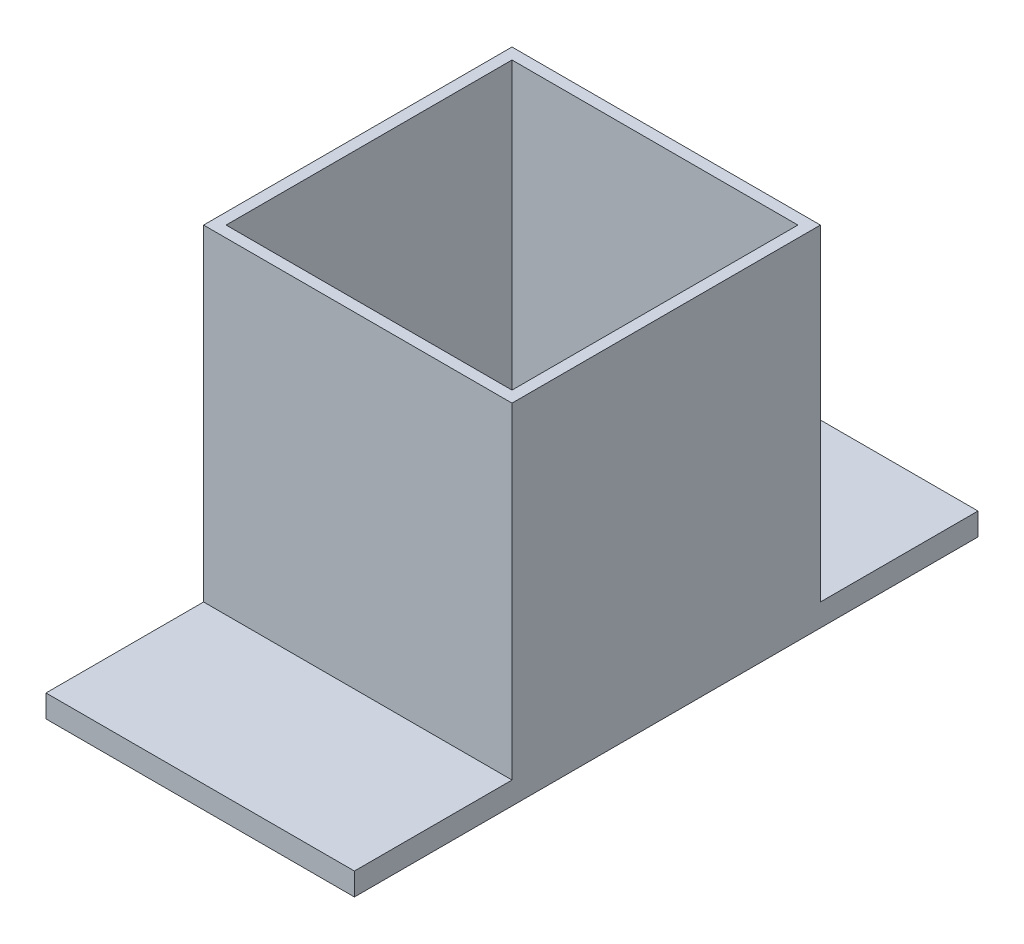
ISO-10303-21;
HEADER;
FILE_DESCRIPTION(('STEP AP214'),'2;1');
FILE_NAME('part.step','',(''),(''),'','','');
FILE_SCHEMA(('AUTOMOTIVE_DESIGN { 1 0 10303 214 1 1 1 1 }'));
ENDSEC;
DATA;
#1=APPLICATION_CONTEXT('core data for automotive mechanical design processes');
#2=APPLICATION_PROTOCOL_DEFINITION('international standard','automotive_design',2000,#1);
#3=PRODUCT_CONTEXT('',#1,'mechanical');
#4=PRODUCT('Part','Part','',(#3));
#5=PRODUCT_RELATED_PRODUCT_CATEGORY('part','',(#4));
#6=PRODUCT_DEFINITION_FORMATION('','',#4);
#7=PRODUCT_DEFINITION_CONTEXT('part definition',#1,'design');
#8=PRODUCT_DEFINITION('design','',#6,#7);
#9=PRODUCT_DEFINITION_SHAPE('','',#8);
#10=(LENGTH_UNIT() NAMED_UNIT(*) SI_UNIT(.MILLI.,.METRE.));
#11=(NAMED_UNIT(*) PLANE_ANGLE_UNIT() SI_UNIT($,.RADIAN.));
#12=(NAMED_UNIT(*) SI_UNIT($,.STERADIAN.) SOLID_ANGLE_UNIT());
#13=UNCERTAINTY_MEASURE_WITH_UNIT(LENGTH_MEASURE(1.E-05),#10,'distance_accuracy_value','');
#14=(GEOMETRIC_REPRESENTATION_CONTEXT(3) GLOBAL_UNCERTAINTY_ASSIGNED_CONTEXT((#13)) GLOBAL_UNIT_ASSIGNED_CONTEXT((#10,
#11,#12)) REPRESENTATION_CONTEXT('',''));
#15=CARTESIAN_POINT('',(0.,0.,0.));
#16=DIRECTION('',(0.,0.,1.));
#17=DIRECTION('',(1.,0.,0.));
#18=AXIS2_PLACEMENT_3D('',#15,#16,#17);
#19=CARTESIAN_POINT('',(0.,-0.5,-13.7));
#20=DIRECTION('',(0.,0.,1.));
#21=DIRECTION('',(1.,0.,0.));
#22=AXIS2_PLACEMENT_3D('',#19,#20,#21);
#23=PLANE('',#22);
#24=DIRECTION('',(1.,0.,0.));
#25=VECTOR('',#24,1.);
#26=CARTESIAN_POINT('',(13.7,0.5,-13.7));
#27=LINE('',#26,#25);
#28=CARTESIAN_POINT('',(0.,0.5,-13.7));
#29=VERTEX_POINT('',#28);
#30=CARTESIAN_POINT('',(13.7,0.5,-13.7));
#31=VERTEX_POINT('',#30);
#32=EDGE_CURVE('E56',#29,#31,#27,.T.);
#33=ORIENTED_EDGE('',*,*,#32,.F.);
#34=DIRECTION('',(0.,1.,0.));
#35=VECTOR('',#34,1.);
#36=CARTESIAN_POINT('',(0.,-0.5,-13.7));
#37=LINE('',#36,#35);
#38=CARTESIAN_POINT('',(0.,15.,-13.7));
#39=VERTEX_POINT('',#38);
#40=EDGE_CURVE('E42',#29,#39,#37,.T.);
#41=ORIENTED_EDGE('',*,*,#40,.T.);
#42=DIRECTION('',(1.,0.,0.));
#43=VECTOR('',#42,1.);
#44=CARTESIAN_POINT('',(0.,15.,-13.7));
#45=LINE('',#44,#43);
#46=CARTESIAN_POINT('',(13.7,15.,-13.7));
#47=VERTEX_POINT('',#46);
#48=EDGE_CURVE('E220',#39,#47,#45,.T.);
#49=ORIENTED_EDGE('',*,*,#48,.T.);
#50=DIRECTION('',(0.,1.,0.));
#51=VECTOR('',#50,1.);
#52=CARTESIAN_POINT('',(13.7,-0.5,-13.7));
#53=LINE('',#52,#51);
#54=EDGE_CURVE('E11',#31,#47,#53,.T.);
#55=ORIENTED_EDGE('',*,*,#54,.F.);
#56=EDGE_LOOP('',(#33,#41,#49,#55));
#57=FACE_BOUND('',#56,.T.);
#58=ADVANCED_FACE('F39',(#57),#23,.F.);
#59=CARTESIAN_POINT('',(13.7,-0.5,0.));
#60=DIRECTION('',(1.,0.,0.));
#61=DIRECTION('',(0.,0.,-1.));
#62=AXIS2_PLACEMENT_3D('',#59,#60,#61);
#63=PLANE('',#62);
#64=DIRECTION('',(0.,0.,-1.));
#65=VECTOR('',#64,1.);
#66=CARTESIAN_POINT('',(13.7,-0.5,0.));
#67=LINE('',#66,#65);
#68=CARTESIAN_POINT('',(13.7,-0.5,7.));
#69=VERTEX_POINT('',#68);
#70=CARTESIAN_POINT('',(13.7,-0.5,-20.7));
#71=VERTEX_POINT('',#70);
#72=EDGE_CURVE('E129',#69,#71,#67,.T.);
#73=ORIENTED_EDGE('',*,*,#72,.T.);
#74=DIRECTION('',(0.,-1.,0.));
#75=VECTOR('',#74,1.);
#76=CARTESIAN_POINT('',(13.7,-0.5,-20.7));
#77=LINE('',#76,#75);
#78=CARTESIAN_POINT('',(13.7,0.5,-20.7));
#79=VERTEX_POINT('',#78);
#80=EDGE_CURVE('E134',#79,#71,#77,.T.);
#81=ORIENTED_EDGE('',*,*,#80,.F.);
#82=DIRECTION('',(0.,0.,1.));
#83=VECTOR('',#82,1.);
#84=CARTESIAN_POINT('',(13.7,0.5,-20.7));
#85=LINE('',#84,#83);
#86=EDGE_CURVE('E163',#79,#31,#85,.T.);
#87=ORIENTED_EDGE('',*,*,#86,.T.);
#88=ORIENTED_EDGE('',*,*,#54,.T.);
#89=DIRECTION('',(0.,0.,-1.));
#90=VECTOR('',#89,1.);
#91=CARTESIAN_POINT('',(13.7,15.,0.));
#92=LINE('',#91,#90);
#93=CARTESIAN_POINT('',(13.7,15.,0.));
#94=VERTEX_POINT('',#93);
#95=EDGE_CURVE('E216',#94,#47,#92,.T.);
#96=ORIENTED_EDGE('',*,*,#95,.F.);
#97=DIRECTION('',(0.,1.,0.));
#98=VECTOR('',#97,1.);
#99=CARTESIAN_POINT('',(13.7,-0.5,0.));
#100=LINE('',#99,#98);
#101=CARTESIAN_POINT('',(13.7,0.5,0.));
#102=VERTEX_POINT('',#101);
#103=EDGE_CURVE('E48',#102,#94,#100,.T.);
#104=ORIENTED_EDGE('',*,*,#103,.F.);
#105=DIRECTION('',(0.,0.,-1.));
#106=VECTOR('',#105,1.);
#107=CARTESIAN_POINT('',(13.7,0.5,7.));
#108=LINE('',#107,#106);
#109=CARTESIAN_POINT('',(13.7,0.5,7.));
#110=VERTEX_POINT('',#109);
#111=EDGE_CURVE('E189',#110,#102,#108,.T.);
#112=ORIENTED_EDGE('',*,*,#111,.F.);
#113=DIRECTION('',(0.,1.,0.));
#114=VECTOR('',#113,1.);
#115=CARTESIAN_POINT('',(13.7,-0.5,7.));
#116=LINE('',#115,#114);
#117=EDGE_CURVE('E136',#69,#110,#116,.T.);
#118=ORIENTED_EDGE('',*,*,#117,.F.);
#119=EDGE_LOOP('',(#73,#81,#87,#88,#96,#104,#112,#118));
#120=FACE_BOUND('',#119,.T.);
#121=ADVANCED_FACE('F131',(#120),#63,.T.);
#122=CARTESIAN_POINT('',(0.,-0.5,0.));
#123=DIRECTION('',(0.,0.,1.));
#124=DIRECTION('',(1.,0.,0.));
#125=AXIS2_PLACEMENT_3D('',#122,#123,#124);
#126=PLANE('',#125);
#127=DIRECTION('',(-1.,0.,0.));
#128=VECTOR('',#127,1.);
#129=CARTESIAN_POINT('',(0.,0.5,0.));
#130=LINE('',#129,#128);
#131=CARTESIAN_POINT('',(0.,0.5,0.));
#132=VERTEX_POINT('',#131);
#133=EDGE_CURVE('E64',#102,#132,#130,.T.);
#134=ORIENTED_EDGE('',*,*,#133,.F.);
#135=ORIENTED_EDGE('',*,*,#103,.T.);
#136=DIRECTION('',(1.,0.,0.));
#137=VECTOR('',#136,1.);
#138=CARTESIAN_POINT('',(0.,15.,0.));
#139=LINE('',#138,#137);
#140=CARTESIAN_POINT('',(0.,15.,0.));
#141=VERTEX_POINT('',#140);
#142=EDGE_CURVE('E212',#141,#94,#139,.T.);
#143=ORIENTED_EDGE('',*,*,#142,.F.);
#144=DIRECTION('',(0.,1.,0.));
#145=VECTOR('',#144,1.);
#146=CARTESIAN_POINT('',(0.,-0.5,0.));
#147=LINE('',#146,#145);
#148=EDGE_CURVE('E253',#132,#141,#147,.T.);
#149=ORIENTED_EDGE('',*,*,#148,.F.);
#150=EDGE_LOOP('',(#134,#135,#143,#149));
#151=FACE_BOUND('',#150,.T.);
#152=ADVANCED_FACE('F292',(#151),#126,.T.);
#153=CARTESIAN_POINT('',(0.,-0.5,0.));
#154=DIRECTION('',(1.,0.,0.));
#155=DIRECTION('',(0.,0.,-1.));
#156=AXIS2_PLACEMENT_3D('',#153,#154,#155);
#157=PLANE('',#156);
#158=DIRECTION('',(0.,0.,-1.));
#159=VECTOR('',#158,1.);
#160=CARTESIAN_POINT('',(0.,-0.5,0.));
#161=LINE('',#160,#159);
#162=CARTESIAN_POINT('',(0.,-0.5,7.));
#163=VERTEX_POINT('',#162);
#164=CARTESIAN_POINT('',(0.,-0.5,-20.7));
#165=VERTEX_POINT('',#164);
#166=EDGE_CURVE('E141',#163,#165,#161,.T.);
#167=ORIENTED_EDGE('',*,*,#166,.F.);
#168=DIRECTION('',(0.,-1.,0.));
#169=VECTOR('',#168,1.);
#170=CARTESIAN_POINT('',(0.,-0.5,7.));
#171=LINE('',#170,#169);
#172=CARTESIAN_POINT('',(0.,0.5,7.));
#173=VERTEX_POINT('',#172);
#174=EDGE_CURVE('E171',#173,#163,#171,.T.);
#175=ORIENTED_EDGE('',*,*,#174,.F.);
#176=DIRECTION('',(0.,0.,-1.));
#177=VECTOR('',#176,1.);
#178=CARTESIAN_POINT('',(0.,0.5,7.));
#179=LINE('',#178,#177);
#180=EDGE_CURVE('E183',#173,#132,#179,.T.);
#181=ORIENTED_EDGE('',*,*,#180,.T.);
#182=ORIENTED_EDGE('',*,*,#148,.T.);
#183=DIRECTION('',(0.,0.,-1.));
#184=VECTOR('',#183,1.);
#185=CARTESIAN_POINT('',(0.,15.,0.));
#186=LINE('',#185,#184);
#187=EDGE_CURVE('E208',#141,#39,#186,.T.);
#188=ORIENTED_EDGE('',*,*,#187,.T.);
#189=ORIENTED_EDGE('',*,*,#40,.F.);
#190=DIRECTION('',(0.,0.,1.));
#191=VECTOR('',#190,1.);
#192=CARTESIAN_POINT('',(0.,0.5,-20.7));
#193=LINE('',#192,#191);
#194=CARTESIAN_POINT('',(0.,0.5,-20.7));
#195=VERTEX_POINT('',#194);
#196=EDGE_CURVE('E167',#195,#29,#193,.T.);
#197=ORIENTED_EDGE('',*,*,#196,.F.);
#198=DIRECTION('',(0.,1.,0.));
#199=VECTOR('',#198,1.);
#200=CARTESIAN_POINT('',(0.,-0.5,-20.7));
#201=LINE('',#200,#199);
#202=EDGE_CURVE('E149',#165,#195,#201,.T.);
#203=ORIENTED_EDGE('',*,*,#202,.F.);
#204=EDGE_LOOP('',(#167,#175,#181,#182,#188,#189,#197,#203));
#205=FACE_BOUND('',#204,.T.);
#206=ADVANCED_FACE('F261',(#205),#157,.F.);
#207=CARTESIAN_POINT('',(0.,-0.5,0.));
#208=DIRECTION('',(0.,1.,0.));
#209=DIRECTION('',(0.,0.,1.));
#210=AXIS2_PLACEMENT_3D('',#207,#208,#209);
#211=PLANE('',#210);
#212=ORIENTED_EDGE('',*,*,#166,.T.);
#213=DIRECTION('',(-1.,0.,0.));
#214=VECTOR('',#213,1.);
#215=CARTESIAN_POINT('',(13.7,-0.5,-20.7));
#216=LINE('',#215,#214);
#217=EDGE_CURVE('E144',#71,#165,#216,.T.);
#218=ORIENTED_EDGE('',*,*,#217,.F.);
#219=ORIENTED_EDGE('',*,*,#72,.F.);
#220=DIRECTION('',(1.,0.,0.));
#221=VECTOR('',#220,1.);
#222=CARTESIAN_POINT('',(0.,-0.5,7.));
#223=LINE('',#222,#221);
#224=EDGE_CURVE('E175',#163,#69,#223,.T.);
#225=ORIENTED_EDGE('',*,*,#224,.F.);
#226=EDGE_LOOP('',(#212,#218,#219,#225));
#227=FACE_BOUND('',#226,.T.);
#228=ADVANCED_FACE('F145',(#227),#211,.F.);
#229=CARTESIAN_POINT('',(13.2,15.,0.));
#230=DIRECTION('',(-1.,0.,0.));
#231=DIRECTION('',(0.,0.,1.));
#232=AXIS2_PLACEMENT_3D('',#229,#230,#231);
#233=PLANE('',#232);
#234=DIRECTION('',(0.,0.,-1.));
#235=VECTOR('',#234,1.);
#236=CARTESIAN_POINT('',(13.2,0.,0.));
#237=LINE('',#236,#235);
#238=CARTESIAN_POINT('',(13.2,0.,-0.500000000000002));
#239=VERTEX_POINT('',#238);
#240=CARTESIAN_POINT('',(13.2,0.,-13.2));
#241=VERTEX_POINT('',#240);
#242=EDGE_CURVE('E193',#239,#241,#237,.T.);
#243=ORIENTED_EDGE('',*,*,#242,.F.);
#244=DIRECTION('',(0.,-1.,0.));
#245=VECTOR('',#244,1.);
#246=CARTESIAN_POINT('',(13.2,15.,-0.500000000000002));
#247=LINE('',#246,#245);
#248=CARTESIAN_POINT('',(13.2,15.,-0.500000000000002));
#249=VERTEX_POINT('',#248);
#250=EDGE_CURVE('E247',#249,#239,#247,.T.);
#251=ORIENTED_EDGE('',*,*,#250,.F.);
#252=DIRECTION('',(0.,0.,-1.));
#253=VECTOR('',#252,1.);
#254=CARTESIAN_POINT('',(13.2,15.,0.));
#255=LINE('',#254,#253);
#256=CARTESIAN_POINT('',(13.2,15.,-13.2));
#257=VERTEX_POINT('',#256);
#258=EDGE_CURVE('E194',#249,#257,#255,.T.);
#259=ORIENTED_EDGE('',*,*,#258,.T.);
#260=DIRECTION('',(0.,-1.,0.));
#261=VECTOR('',#260,1.);
#262=CARTESIAN_POINT('',(13.2,15.,-13.2));
#263=LINE('',#262,#261);
#264=EDGE_CURVE('E224',#257,#241,#263,.T.);
#265=ORIENTED_EDGE('',*,*,#264,.T.);
#266=EDGE_LOOP('',(#243,#251,#259,#265));
#267=FACE_BOUND('',#266,.T.);
#268=ADVANCED_FACE('F302',(#267),#233,.T.);
#269=CARTESIAN_POINT('',(0.,15.,-0.5));
#270=DIRECTION('',(0.,0.,1.));
#271=DIRECTION('',(1.,0.,0.));
#272=AXIS2_PLACEMENT_3D('',#269,#270,#271);
#273=PLANE('',#272);
#274=DIRECTION('',(-1.,0.,0.));
#275=VECTOR('',#274,1.);
#276=CARTESIAN_POINT('',(0.,0.,-0.5));
#277=LINE('',#276,#275);
#278=CARTESIAN_POINT('',(0.5,0.,-0.5));
#279=VERTEX_POINT('',#278);
#280=EDGE_CURVE('E228',#239,#279,#277,.T.);
#281=ORIENTED_EDGE('',*,*,#280,.T.);
#282=DIRECTION('',(0.,-1.,0.));
#283=VECTOR('',#282,1.);
#284=CARTESIAN_POINT('',(0.5,15.,-0.5));
#285=LINE('',#284,#283);
#286=CARTESIAN_POINT('',(0.5,15.,-0.5));
#287=VERTEX_POINT('',#286);
#288=EDGE_CURVE('E243',#287,#279,#285,.T.);
#289=ORIENTED_EDGE('',*,*,#288,.F.);
#290=DIRECTION('',(-1.,0.,0.));
#291=VECTOR('',#290,1.);
#292=CARTESIAN_POINT('',(0.,15.,-0.5));
#293=LINE('',#292,#291);
#294=EDGE_CURVE('E198',#249,#287,#293,.T.);
#295=ORIENTED_EDGE('',*,*,#294,.F.);
#296=ORIENTED_EDGE('',*,*,#250,.T.);
#297=EDGE_LOOP('',(#281,#289,#295,#296));
#298=FACE_BOUND('',#297,.T.);
#299=ADVANCED_FACE('F306',(#298),#273,.F.);
#300=CARTESIAN_POINT('',(0.5,15.,0.));
#301=DIRECTION('',(-1.,0.,0.));
#302=DIRECTION('',(0.,0.,1.));
#303=AXIS2_PLACEMENT_3D('',#300,#301,#302);
#304=PLANE('',#303);
#305=DIRECTION('',(0.,0.,-1.));
#306=VECTOR('',#305,1.);
#307=CARTESIAN_POINT('',(0.5,0.,0.));
#308=LINE('',#307,#306);
#309=CARTESIAN_POINT('',(0.5,0.,-13.2));
#310=VERTEX_POINT('',#309);
#311=EDGE_CURVE('E231',#279,#310,#308,.T.);
#312=ORIENTED_EDGE('',*,*,#311,.T.);
#313=DIRECTION('',(0.,-1.,0.));
#314=VECTOR('',#313,1.);
#315=CARTESIAN_POINT('',(0.5,15.,-13.2));
#316=LINE('',#315,#314);
#317=CARTESIAN_POINT('',(0.5,15.,-13.2));
#318=VERTEX_POINT('',#317);
#319=EDGE_CURVE('E240',#318,#310,#316,.T.);
#320=ORIENTED_EDGE('',*,*,#319,.F.);
#321=DIRECTION('',(0.,0.,-1.));
#322=VECTOR('',#321,1.);
#323=CARTESIAN_POINT('',(0.5,15.,0.));
#324=LINE('',#323,#322);
#325=EDGE_CURVE('E202',#287,#318,#324,.T.);
#326=ORIENTED_EDGE('',*,*,#325,.F.);
#327=ORIENTED_EDGE('',*,*,#288,.T.);
#328=EDGE_LOOP('',(#312,#320,#326,#327));
#329=FACE_BOUND('',#328,.T.);
#330=ADVANCED_FACE('F312',(#329),#304,.F.);
#331=CARTESIAN_POINT('',(0.,15.,-13.2));
#332=DIRECTION('',(0.,0.,-1.));
#333=DIRECTION('',(-1.,0.,0.));
#334=AXIS2_PLACEMENT_3D('',#331,#332,#333);
#335=PLANE('',#334);
#336=DIRECTION('',(1.,0.,0.));
#337=VECTOR('',#336,1.);
#338=CARTESIAN_POINT('',(0.,0.,-13.2));
#339=LINE('',#338,#337);
#340=EDGE_CURVE('E199',#310,#241,#339,.T.);
#341=ORIENTED_EDGE('',*,*,#340,.T.);
#342=ORIENTED_EDGE('',*,*,#264,.F.);
#343=DIRECTION('',(1.,0.,0.));
#344=VECTOR('',#343,1.);
#345=CARTESIAN_POINT('',(0.,15.,-13.2));
#346=LINE('',#345,#344);
#347=EDGE_CURVE('E205',#318,#257,#346,.T.);
#348=ORIENTED_EDGE('',*,*,#347,.F.);
#349=ORIENTED_EDGE('',*,*,#319,.T.);
#350=EDGE_LOOP('',(#341,#342,#348,#349));
#351=FACE_BOUND('',#350,.T.);
#352=ADVANCED_FACE('F316',(#351),#335,.F.);
#353=CARTESIAN_POINT('',(0.,15.,0.));
#354=DIRECTION('',(0.,1.,0.));
#355=DIRECTION('',(0.,0.,1.));
#356=AXIS2_PLACEMENT_3D('',#353,#354,#355);
#357=PLANE('',#356);
#358=ORIENTED_EDGE('',*,*,#258,.F.);
#359=ORIENTED_EDGE('',*,*,#294,.T.);
#360=ORIENTED_EDGE('',*,*,#325,.T.);
#361=ORIENTED_EDGE('',*,*,#347,.T.);
#362=EDGE_LOOP('',(#358,#359,#360,#361));
#363=FACE_BOUND('',#362,.T.);
#364=ORIENTED_EDGE('',*,*,#187,.F.);
#365=ORIENTED_EDGE('',*,*,#142,.T.);
#366=ORIENTED_EDGE('',*,*,#95,.T.);
#367=ORIENTED_EDGE('',*,*,#48,.F.);
#368=EDGE_LOOP('',(#364,#365,#366,#367));
#369=FACE_BOUND('',#368,.T.);
#370=ADVANCED_FACE('F263',(#363,#369),#357,.T.);
#371=CARTESIAN_POINT('',(0.,0.,0.));
#372=DIRECTION('',(0.,1.,0.));
#373=DIRECTION('',(0.,0.,1.));
#374=AXIS2_PLACEMENT_3D('',#371,#372,#373);
#375=PLANE('',#374);
#376=ORIENTED_EDGE('',*,*,#242,.T.);
#377=ORIENTED_EDGE('',*,*,#340,.F.);
#378=ORIENTED_EDGE('',*,*,#311,.F.);
#379=ORIENTED_EDGE('',*,*,#280,.F.);
#380=EDGE_LOOP('',(#376,#377,#378,#379));
#381=FACE_BOUND('',#380,.T.);
#382=ADVANCED_FACE('F275',(#381),#375,.T.);
#383=CARTESIAN_POINT('',(0.,0.5,7.));
#384=DIRECTION('',(0.,-1.,0.));
#385=DIRECTION('',(0.,0.,-1.));
#386=AXIS2_PLACEMENT_3D('',#383,#384,#385);
#387=PLANE('',#386);
#388=ORIENTED_EDGE('',*,*,#133,.T.);
#389=ORIENTED_EDGE('',*,*,#180,.F.);
#390=DIRECTION('',(-1.,0.,0.));
#391=VECTOR('',#390,1.);
#392=CARTESIAN_POINT('',(0.,0.5,7.));
#393=LINE('',#392,#391);
#394=EDGE_CURVE('E180',#110,#173,#393,.T.);
#395=ORIENTED_EDGE('',*,*,#394,.F.);
#396=ORIENTED_EDGE('',*,*,#111,.T.);
#397=EDGE_LOOP('',(#388,#389,#395,#396));
#398=FACE_BOUND('',#397,.T.);
#399=ADVANCED_FACE('F273',(#398),#387,.F.);
#400=CARTESIAN_POINT('',(0.,0.,7.));
#401=DIRECTION('',(0.,0.,-1.));
#402=DIRECTION('',(-1.,0.,0.));
#403=AXIS2_PLACEMENT_3D('',#400,#401,#402);
#404=PLANE('',#403);
#405=ORIENTED_EDGE('',*,*,#174,.T.);
#406=ORIENTED_EDGE('',*,*,#224,.T.);
#407=ORIENTED_EDGE('',*,*,#117,.T.);
#408=ORIENTED_EDGE('',*,*,#394,.T.);
#409=EDGE_LOOP('',(#405,#406,#407,#408));
#410=FACE_BOUND('',#409,.T.);
#411=ADVANCED_FACE('F269',(#410),#404,.F.);
#412=CARTESIAN_POINT('',(13.7,0.5,-20.7));
#413=DIRECTION('',(0.,-1.,0.));
#414=DIRECTION('',(0.,0.,-1.));
#415=AXIS2_PLACEMENT_3D('',#412,#413,#414);
#416=PLANE('',#415);
#417=ORIENTED_EDGE('',*,*,#32,.T.);
#418=ORIENTED_EDGE('',*,*,#86,.F.);
#419=DIRECTION('',(1.,0.,0.));
#420=VECTOR('',#419,1.);
#421=CARTESIAN_POINT('',(13.7,0.5,-20.7));
#422=LINE('',#421,#420);
#423=EDGE_CURVE('E153',#195,#79,#422,.T.);
#424=ORIENTED_EDGE('',*,*,#423,.F.);
#425=ORIENTED_EDGE('',*,*,#196,.T.);
#426=EDGE_LOOP('',(#417,#418,#424,#425));
#427=FACE_BOUND('',#426,.T.);
#428=ADVANCED_FACE('F266',(#427),#416,.F.);
#429=CARTESIAN_POINT('',(0.,0.,-20.7));
#430=DIRECTION('',(0.,0.,1.));
#431=DIRECTION('',(1.,0.,0.));
#432=AXIS2_PLACEMENT_3D('',#429,#430,#431);
#433=PLANE('',#432);
#434=ORIENTED_EDGE('',*,*,#80,.T.);
#435=ORIENTED_EDGE('',*,*,#217,.T.);
#436=ORIENTED_EDGE('',*,*,#202,.T.);
#437=ORIENTED_EDGE('',*,*,#423,.T.);
#438=EDGE_LOOP('',(#434,#435,#436,#437));
#439=FACE_BOUND('',#438,.T.);
#440=ADVANCED_FACE('F151',(#439),#433,.F.);
#441=CLOSED_SHELL('',(#58,#121,#152,#206,#228,#268,#299,#330,#352,#370,#382,#399,#411,#428,#440));
#442=MANIFOLD_SOLID_BREP('B2',#441);
#443=ADVANCED_BREP_SHAPE_REPRESENTATION('',(#18,#442),#14);
#444=SHAPE_DEFINITION_REPRESENTATION(#9,#443);
ENDSEC;
END-ISO-10303-21;
